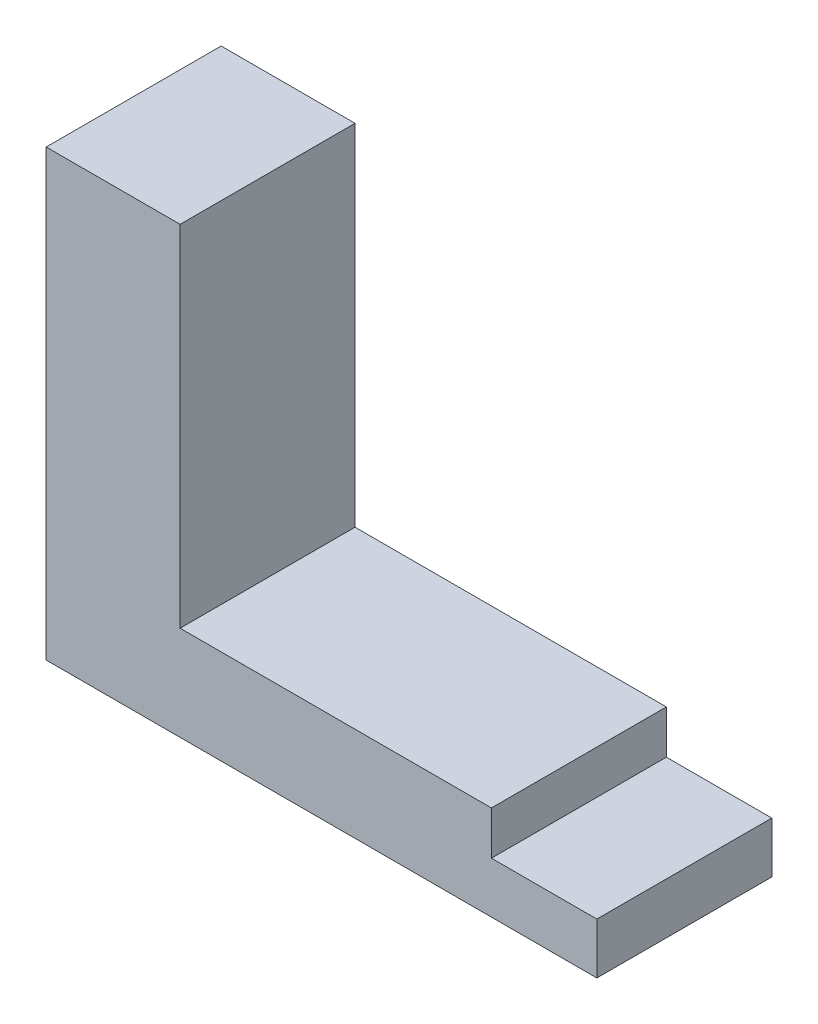
ISO-10303-21;
HEADER;
FILE_DESCRIPTION(('STEP AP214'),'2;1');
FILE_NAME('part.step','',(''),(''),'','','');
FILE_SCHEMA(('AUTOMOTIVE_DESIGN { 1 0 10303 214 1 1 1 1 }'));
ENDSEC;
DATA;
#1=APPLICATION_CONTEXT('core data for automotive mechanical design processes');
#2=APPLICATION_PROTOCOL_DEFINITION('international standard','automotive_design',2000,#1);
#3=PRODUCT_CONTEXT('',#1,'mechanical');
#4=PRODUCT('Part','Part','',(#3));
#5=PRODUCT_RELATED_PRODUCT_CATEGORY('part','',(#4));
#6=PRODUCT_DEFINITION_FORMATION('','',#4);
#7=PRODUCT_DEFINITION_CONTEXT('part definition',#1,'design');
#8=PRODUCT_DEFINITION('design','',#6,#7);
#9=PRODUCT_DEFINITION_SHAPE('','',#8);
#10=(LENGTH_UNIT() NAMED_UNIT(*) SI_UNIT(.MILLI.,.METRE.));
#11=(NAMED_UNIT(*) PLANE_ANGLE_UNIT() SI_UNIT($,.RADIAN.));
#12=(NAMED_UNIT(*) SI_UNIT($,.STERADIAN.) SOLID_ANGLE_UNIT());
#13=UNCERTAINTY_MEASURE_WITH_UNIT(LENGTH_MEASURE(1.E-05),#10,'distance_accuracy_value','');
#14=(GEOMETRIC_REPRESENTATION_CONTEXT(3) GLOBAL_UNCERTAINTY_ASSIGNED_CONTEXT((#13)) GLOBAL_UNIT_ASSIGNED_CONTEXT((#10,
#11,#12)) REPRESENTATION_CONTEXT('',''));
#15=CARTESIAN_POINT('',(0.,0.,0.));
#16=DIRECTION('',(0.,0.,1.));
#17=DIRECTION('',(1.,0.,0.));
#18=AXIS2_PLACEMENT_3D('',#15,#16,#17);
#19=CARTESIAN_POINT('',(62.9536153149657,0.,20.));
#20=DIRECTION('',(0.,1.,0.));
#21=DIRECTION('',(0.,0.,1.));
#22=AXIS2_PLACEMENT_3D('',#19,#20,#21);
#23=PLANE('',#22);
#24=DIRECTION('',(1.,0.,0.));
#25=VECTOR('',#24,1.);
#26=CARTESIAN_POINT('',(62.9536153149657,0.,0.));
#27=LINE('',#26,#25);
#28=CARTESIAN_POINT('',(0.,0.,0.));
#29=VERTEX_POINT('',#28);
#30=CARTESIAN_POINT('',(62.9536153149657,0.,0.));
#31=VERTEX_POINT('',#30);
#32=EDGE_CURVE('E129',#29,#31,#27,.T.);
#33=ORIENTED_EDGE('',*,*,#32,.T.);
#34=DIRECTION('',(0.,0.,-1.));
#35=VECTOR('',#34,1.);
#36=CARTESIAN_POINT('',(62.9536153149657,0.,20.));
#37=LINE('',#36,#35);
#38=CARTESIAN_POINT('',(62.9536153149657,0.,20.));
#39=VERTEX_POINT('',#38);
#40=EDGE_CURVE('E11',#39,#31,#37,.T.);
#41=ORIENTED_EDGE('',*,*,#40,.F.);
#42=DIRECTION('',(1.,0.,0.));
#43=VECTOR('',#42,1.);
#44=CARTESIAN_POINT('',(62.9536153149657,0.,20.));
#45=LINE('',#44,#43);
#46=CARTESIAN_POINT('',(0.,0.,20.));
#47=VERTEX_POINT('',#46);
#48=EDGE_CURVE('E143',#47,#39,#45,.T.);
#49=ORIENTED_EDGE('',*,*,#48,.F.);
#50=DIRECTION('',(0.,0.,-1.));
#51=VECTOR('',#50,1.);
#52=CARTESIAN_POINT('',(0.,0.,20.));
#53=LINE('',#52,#51);
#54=EDGE_CURVE('E125',#47,#29,#53,.T.);
#55=ORIENTED_EDGE('',*,*,#54,.T.);
#56=EDGE_LOOP('',(#33,#41,#49,#55));
#57=FACE_BOUND('',#56,.T.);
#58=ADVANCED_FACE('F33',(#57),#23,.F.);
#59=CARTESIAN_POINT('',(62.9536153149657,5.83612543193451,20.));
#60=DIRECTION('',(-1.,0.,0.));
#61=DIRECTION('',(0.,0.,1.));
#62=AXIS2_PLACEMENT_3D('',#59,#60,#61);
#63=PLANE('',#62);
#64=DIRECTION('',(0.,1.,0.));
#65=VECTOR('',#64,1.);
#66=CARTESIAN_POINT('',(62.9536153149657,5.83612543193451,0.));
#67=LINE('',#66,#65);
#68=CARTESIAN_POINT('',(62.9536153149657,5.83612543193451,0.));
#69=VERTEX_POINT('',#68);
#70=EDGE_CURVE('E132',#31,#69,#67,.T.);
#71=ORIENTED_EDGE('',*,*,#70,.T.);
#72=DIRECTION('',(0.,0.,-1.));
#73=VECTOR('',#72,1.);
#74=CARTESIAN_POINT('',(62.9536153149657,5.83612543193451,20.));
#75=LINE('',#74,#73);
#76=CARTESIAN_POINT('',(62.9536153149657,5.83612543193451,20.));
#77=VERTEX_POINT('',#76);
#78=EDGE_CURVE('E41',#77,#69,#75,.T.);
#79=ORIENTED_EDGE('',*,*,#78,.F.);
#80=DIRECTION('',(0.,1.,0.));
#81=VECTOR('',#80,1.);
#82=CARTESIAN_POINT('',(62.9536153149657,5.83612543193451,20.));
#83=LINE('',#82,#81);
#84=EDGE_CURVE('E92',#39,#77,#83,.T.);
#85=ORIENTED_EDGE('',*,*,#84,.F.);
#86=ORIENTED_EDGE('',*,*,#40,.T.);
#87=EDGE_LOOP('',(#71,#79,#85,#86));
#88=FACE_BOUND('',#87,.T.);
#89=ADVANCED_FACE('F178',(#88),#63,.F.);
#90=CARTESIAN_POINT('',(50.8986677014617,5.83612543193451,20.));
#91=DIRECTION('',(0.,-1.,0.));
#92=DIRECTION('',(0.,0.,-1.));
#93=AXIS2_PLACEMENT_3D('',#90,#91,#92);
#94=PLANE('',#93);
#95=DIRECTION('',(-1.,0.,0.));
#96=VECTOR('',#95,1.);
#97=CARTESIAN_POINT('',(50.8986677014617,5.83612543193451,0.));
#98=LINE('',#97,#96);
#99=CARTESIAN_POINT('',(50.8986677014617,5.83612543193451,0.));
#100=VERTEX_POINT('',#99);
#101=EDGE_CURVE('E134',#69,#100,#98,.T.);
#102=ORIENTED_EDGE('',*,*,#101,.T.);
#103=DIRECTION('',(0.,0.,-1.));
#104=VECTOR('',#103,1.);
#105=CARTESIAN_POINT('',(50.8986677014617,5.83612543193451,20.));
#106=LINE('',#105,#104);
#107=CARTESIAN_POINT('',(50.8986677014617,5.83612543193451,20.));
#108=VERTEX_POINT('',#107);
#109=EDGE_CURVE('E150',#108,#100,#106,.T.);
#110=ORIENTED_EDGE('',*,*,#109,.F.);
#111=DIRECTION('',(-1.,0.,0.));
#112=VECTOR('',#111,1.);
#113=CARTESIAN_POINT('',(50.8986677014617,5.83612543193451,20.));
#114=LINE('',#113,#112);
#115=EDGE_CURVE('E158',#77,#108,#114,.T.);
#116=ORIENTED_EDGE('',*,*,#115,.F.);
#117=ORIENTED_EDGE('',*,*,#78,.T.);
#118=EDGE_LOOP('',(#102,#110,#116,#117));
#119=FACE_BOUND('',#118,.T.);
#120=ADVANCED_FACE('F156',(#119),#94,.F.);
#121=CARTESIAN_POINT('',(50.8986677014617,10.8111831771902,20.));
#122=DIRECTION('',(-1.,0.,0.));
#123=DIRECTION('',(0.,0.,1.));
#124=AXIS2_PLACEMENT_3D('',#121,#122,#123);
#125=PLANE('',#124);
#126=DIRECTION('',(0.,1.,0.));
#127=VECTOR('',#126,1.);
#128=CARTESIAN_POINT('',(50.8986677014617,10.8111831771902,0.));
#129=LINE('',#128,#127);
#130=CARTESIAN_POINT('',(50.8986677014617,10.8111831771902,0.));
#131=VERTEX_POINT('',#130);
#132=EDGE_CURVE('E136',#100,#131,#129,.T.);
#133=ORIENTED_EDGE('',*,*,#132,.T.);
#134=DIRECTION('',(0.,0.,-1.));
#135=VECTOR('',#134,1.);
#136=CARTESIAN_POINT('',(50.8986677014617,10.8111831771902,20.));
#137=LINE('',#136,#135);
#138=CARTESIAN_POINT('',(50.8986677014617,10.8111831771902,20.));
#139=VERTEX_POINT('',#138);
#140=EDGE_CURVE('E147',#139,#131,#137,.T.);
#141=ORIENTED_EDGE('',*,*,#140,.F.);
#142=DIRECTION('',(0.,1.,0.));
#143=VECTOR('',#142,1.);
#144=CARTESIAN_POINT('',(50.8986677014617,10.8111831771902,20.));
#145=LINE('',#144,#143);
#146=EDGE_CURVE('E170',#108,#139,#145,.T.);
#147=ORIENTED_EDGE('',*,*,#146,.F.);
#148=ORIENTED_EDGE('',*,*,#109,.T.);
#149=EDGE_LOOP('',(#133,#141,#147,#148));
#150=FACE_BOUND('',#149,.T.);
#151=ADVANCED_FACE('F166',(#150),#125,.F.);
#152=CARTESIAN_POINT('',(15.307869985402,10.8111831771902,20.));
#153=DIRECTION('',(0.,-1.,0.));
#154=DIRECTION('',(0.,0.,-1.));
#155=AXIS2_PLACEMENT_3D('',#152,#153,#154);
#156=PLANE('',#155);
#157=DIRECTION('',(-1.,0.,0.));
#158=VECTOR('',#157,1.);
#159=CARTESIAN_POINT('',(15.307869985402,10.8111831771902,0.));
#160=LINE('',#159,#158);
#161=CARTESIAN_POINT('',(15.307869985402,10.8111831771902,0.));
#162=VERTEX_POINT('',#161);
#163=EDGE_CURVE('E138',#131,#162,#160,.T.);
#164=ORIENTED_EDGE('',*,*,#163,.T.);
#165=DIRECTION('',(0.,0.,-1.));
#166=VECTOR('',#165,1.);
#167=CARTESIAN_POINT('',(15.307869985402,10.8111831771902,20.));
#168=LINE('',#167,#166);
#169=CARTESIAN_POINT('',(15.307869985402,10.8111831771902,20.));
#170=VERTEX_POINT('',#169);
#171=EDGE_CURVE('E120',#170,#162,#168,.T.);
#172=ORIENTED_EDGE('',*,*,#171,.F.);
#173=DIRECTION('',(-1.,0.,0.));
#174=VECTOR('',#173,1.);
#175=CARTESIAN_POINT('',(15.307869985402,10.8111831771902,20.));
#176=LINE('',#175,#174);
#177=EDGE_CURVE('E111',#139,#170,#176,.T.);
#178=ORIENTED_EDGE('',*,*,#177,.F.);
#179=ORIENTED_EDGE('',*,*,#140,.T.);
#180=EDGE_LOOP('',(#164,#172,#178,#179));
#181=FACE_BOUND('',#180,.T.);
#182=ADVANCED_FACE('F169',(#181),#156,.F.);
#183=CARTESIAN_POINT('',(15.307869985402,50.8029935140529,20.));
#184=DIRECTION('',(-1.,0.,0.));
#185=DIRECTION('',(0.,0.,1.));
#186=AXIS2_PLACEMENT_3D('',#183,#184,#185);
#187=PLANE('',#186);
#188=DIRECTION('',(0.,1.,0.));
#189=VECTOR('',#188,1.);
#190=CARTESIAN_POINT('',(15.307869985402,50.8029935140529,0.));
#191=LINE('',#190,#189);
#192=CARTESIAN_POINT('',(15.307869985402,50.8029935140529,0.));
#193=VERTEX_POINT('',#192);
#194=EDGE_CURVE('E119',#162,#193,#191,.T.);
#195=ORIENTED_EDGE('',*,*,#194,.T.);
#196=DIRECTION('',(0.,0.,-1.));
#197=VECTOR('',#196,1.);
#198=CARTESIAN_POINT('',(15.307869985402,50.8029935140529,20.));
#199=LINE('',#198,#197);
#200=CARTESIAN_POINT('',(15.307869985402,50.8029935140529,20.));
#201=VERTEX_POINT('',#200);
#202=EDGE_CURVE('E116',#201,#193,#199,.T.);
#203=ORIENTED_EDGE('',*,*,#202,.F.);
#204=DIRECTION('',(0.,1.,0.));
#205=VECTOR('',#204,1.);
#206=CARTESIAN_POINT('',(15.307869985402,50.8029935140529,20.));
#207=LINE('',#206,#205);
#208=EDGE_CURVE('E105',#170,#201,#207,.T.);
#209=ORIENTED_EDGE('',*,*,#208,.F.);
#210=ORIENTED_EDGE('',*,*,#171,.T.);
#211=EDGE_LOOP('',(#195,#203,#209,#210));
#212=FACE_BOUND('',#211,.T.);
#213=ADVANCED_FACE('F117',(#212),#187,.F.);
#214=CARTESIAN_POINT('',(0.,50.8029935140529,20.));
#215=DIRECTION('',(0.,-1.,0.));
#216=DIRECTION('',(0.,0.,-1.));
#217=AXIS2_PLACEMENT_3D('',#214,#215,#216);
#218=PLANE('',#217);
#219=DIRECTION('',(-1.,0.,0.));
#220=VECTOR('',#219,1.);
#221=CARTESIAN_POINT('',(0.,50.8029935140529,0.));
#222=LINE('',#221,#220);
#223=CARTESIAN_POINT('',(0.,50.8029935140529,0.));
#224=VERTEX_POINT('',#223);
#225=EDGE_CURVE('E78',#193,#224,#222,.T.);
#226=ORIENTED_EDGE('',*,*,#225,.T.);
#227=DIRECTION('',(0.,0.,-1.));
#228=VECTOR('',#227,1.);
#229=CARTESIAN_POINT('',(0.,50.8029935140529,20.));
#230=LINE('',#229,#228);
#231=CARTESIAN_POINT('',(0.,50.8029935140529,20.));
#232=VERTEX_POINT('',#231);
#233=EDGE_CURVE('E121',#232,#224,#230,.T.);
#234=ORIENTED_EDGE('',*,*,#233,.F.);
#235=DIRECTION('',(-1.,0.,0.));
#236=VECTOR('',#235,1.);
#237=CARTESIAN_POINT('',(0.,50.8029935140529,20.));
#238=LINE('',#237,#236);
#239=EDGE_CURVE('E109',#201,#232,#238,.T.);
#240=ORIENTED_EDGE('',*,*,#239,.F.);
#241=ORIENTED_EDGE('',*,*,#202,.T.);
#242=EDGE_LOOP('',(#226,#234,#240,#241));
#243=FACE_BOUND('',#242,.T.);
#244=ADVANCED_FACE('F123',(#243),#218,.F.);
#245=CARTESIAN_POINT('',(0.,0.,20.));
#246=DIRECTION('',(1.,0.,0.));
#247=DIRECTION('',(0.,0.,-1.));
#248=AXIS2_PLACEMENT_3D('',#245,#246,#247);
#249=PLANE('',#248);
#250=DIRECTION('',(0.,-1.,0.));
#251=VECTOR('',#250,1.);
#252=CARTESIAN_POINT('',(0.,0.,0.));
#253=LINE('',#252,#251);
#254=EDGE_CURVE('E84',#224,#29,#253,.T.);
#255=ORIENTED_EDGE('',*,*,#254,.T.);
#256=ORIENTED_EDGE('',*,*,#54,.F.);
#257=DIRECTION('',(0.,-1.,0.));
#258=VECTOR('',#257,1.);
#259=CARTESIAN_POINT('',(0.,0.,20.));
#260=LINE('',#259,#258);
#261=EDGE_CURVE('E49',#232,#47,#260,.T.);
#262=ORIENTED_EDGE('',*,*,#261,.F.);
#263=ORIENTED_EDGE('',*,*,#233,.T.);
#264=EDGE_LOOP('',(#255,#256,#262,#263));
#265=FACE_BOUND('',#264,.T.);
#266=ADVANCED_FACE('F194',(#265),#249,.F.);
#267=CARTESIAN_POINT('',(0.,0.,20.));
#268=DIRECTION('',(0.,0.,-1.));
#269=DIRECTION('',(-1.,0.,0.));
#270=AXIS2_PLACEMENT_3D('',#267,#268,#269);
#271=PLANE('',#270);
#272=ORIENTED_EDGE('',*,*,#48,.T.);
#273=ORIENTED_EDGE('',*,*,#84,.T.);
#274=ORIENTED_EDGE('',*,*,#115,.T.);
#275=ORIENTED_EDGE('',*,*,#146,.T.);
#276=ORIENTED_EDGE('',*,*,#177,.T.);
#277=ORIENTED_EDGE('',*,*,#208,.T.);
#278=ORIENTED_EDGE('',*,*,#239,.T.);
#279=ORIENTED_EDGE('',*,*,#261,.T.);
#280=EDGE_LOOP('',(#272,#273,#274,#275,#276,#277,#278,#279));
#281=FACE_BOUND('',#280,.T.);
#282=ADVANCED_FACE('F107',(#281),#271,.F.);
#283=CARTESIAN_POINT('',(0.,0.,0.));
#284=DIRECTION('',(0.,0.,-1.));
#285=DIRECTION('',(-1.,0.,0.));
#286=AXIS2_PLACEMENT_3D('',#283,#284,#285);
#287=PLANE('',#286);
#288=ORIENTED_EDGE('',*,*,#32,.F.);
#289=ORIENTED_EDGE('',*,*,#254,.F.);
#290=ORIENTED_EDGE('',*,*,#225,.F.);
#291=ORIENTED_EDGE('',*,*,#194,.F.);
#292=ORIENTED_EDGE('',*,*,#163,.F.);
#293=ORIENTED_EDGE('',*,*,#132,.F.);
#294=ORIENTED_EDGE('',*,*,#101,.F.);
#295=ORIENTED_EDGE('',*,*,#70,.F.);
#296=EDGE_LOOP('',(#288,#289,#290,#291,#292,#293,#294,#295));
#297=FACE_BOUND('',#296,.T.);
#298=ADVANCED_FACE('F162',(#297),#287,.T.);
#299=CLOSED_SHELL('',(#58,#89,#120,#151,#182,#213,#244,#266,#282,#298));
#300=MANIFOLD_SOLID_BREP('B2',#299);
#301=ADVANCED_BREP_SHAPE_REPRESENTATION('',(#18,#300),#14);
#302=SHAPE_DEFINITION_REPRESENTATION(#9,#301);
ENDSEC;
END-ISO-10303-21;
